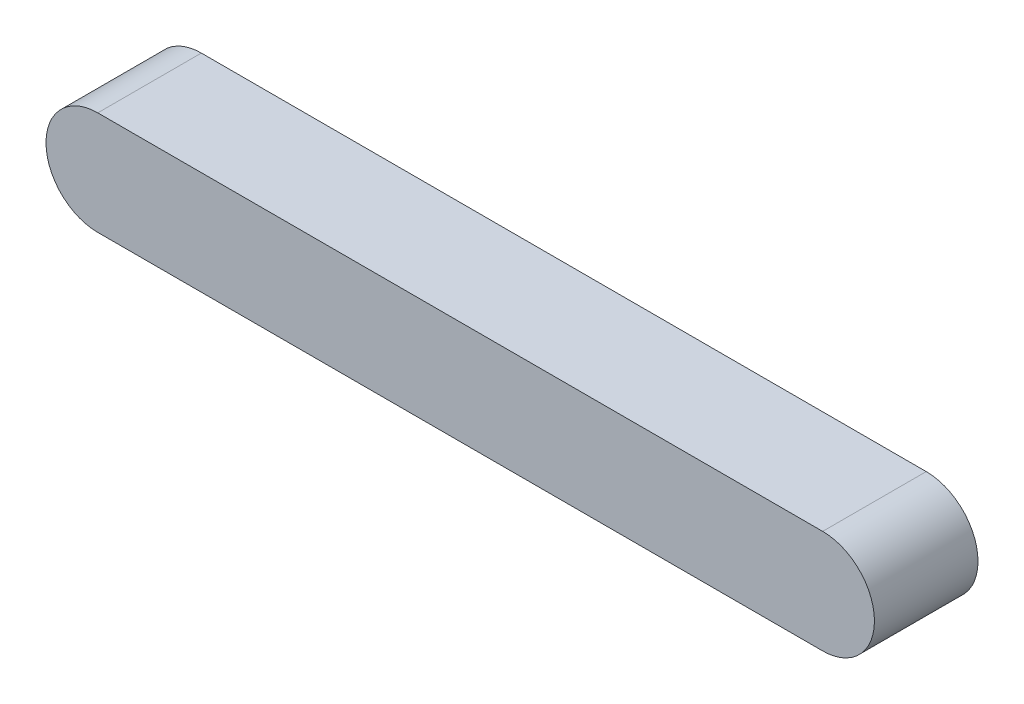
ISO-10303-21;
HEADER;
FILE_DESCRIPTION(('STEP AP214'),'2;1');
FILE_NAME('part.step','',(''),(''),'','','');
FILE_SCHEMA(('AUTOMOTIVE_DESIGN { 1 0 10303 214 1 1 1 1 }'));
ENDSEC;
DATA;
#1=APPLICATION_CONTEXT('core data for automotive mechanical design processes');
#2=APPLICATION_PROTOCOL_DEFINITION('international standard','automotive_design',2000,#1);
#3=PRODUCT_CONTEXT('',#1,'mechanical');
#4=PRODUCT('Part','Part','',(#3));
#5=PRODUCT_RELATED_PRODUCT_CATEGORY('part','',(#4));
#6=PRODUCT_DEFINITION_FORMATION('','',#4);
#7=PRODUCT_DEFINITION_CONTEXT('part definition',#1,'design');
#8=PRODUCT_DEFINITION('design','',#6,#7);
#9=PRODUCT_DEFINITION_SHAPE('','',#8);
#10=(LENGTH_UNIT() NAMED_UNIT(*) SI_UNIT(.MILLI.,.METRE.));
#11=(NAMED_UNIT(*) PLANE_ANGLE_UNIT() SI_UNIT($,.RADIAN.));
#12=(NAMED_UNIT(*) SI_UNIT($,.STERADIAN.) SOLID_ANGLE_UNIT());
#13=UNCERTAINTY_MEASURE_WITH_UNIT(LENGTH_MEASURE(1.E-05),#10,'distance_accuracy_value','');
#14=(GEOMETRIC_REPRESENTATION_CONTEXT(3) GLOBAL_UNCERTAINTY_ASSIGNED_CONTEXT((#13)) GLOBAL_UNIT_ASSIGNED_CONTEXT((#10,
#11,#12)) REPRESENTATION_CONTEXT('',''));
#15=CARTESIAN_POINT('',(0.,0.,0.));
#16=DIRECTION('',(0.,0.,1.));
#17=DIRECTION('',(1.,0.,0.));
#18=AXIS2_PLACEMENT_3D('',#15,#16,#17);
#19=CARTESIAN_POINT('',(-70.,0.,20.));
#20=DIRECTION('',(0.,0.,-1.));
#21=DIRECTION('',(-1.,0.,0.));
#22=AXIS2_PLACEMENT_3D('',#19,#20,#21);
#23=CYLINDRICAL_SURFACE('',#22,9.99999999999995);
#24=CARTESIAN_POINT('',(-70.,0.,0.));
#25=DIRECTION('',(0.,0.,1.));
#26=DIRECTION('',(1.,0.,0.));
#27=AXIS2_PLACEMENT_3D('',#24,#25,#26);
#28=CIRCLE('',#27,9.99999999999995);
#29=CARTESIAN_POINT('',(-70.,9.99999999999995,0.));
#30=VERTEX_POINT('',#29);
#31=CARTESIAN_POINT('',(-70.,-9.99999999999995,0.));
#32=VERTEX_POINT('',#31);
#33=EDGE_CURVE('E100',#30,#32,#28,.T.);
#34=ORIENTED_EDGE('',*,*,#33,.T.);
#35=DIRECTION('',(0.,0.,-1.));
#36=VECTOR('',#35,1.);
#37=CARTESIAN_POINT('',(-70.,-9.99999999999995,20.));
#38=LINE('',#37,#36);
#39=CARTESIAN_POINT('',(-70.,-9.99999999999995,20.));
#40=VERTEX_POINT('',#39);
#41=EDGE_CURVE('E11',#40,#32,#38,.T.);
#42=ORIENTED_EDGE('',*,*,#41,.F.);
#43=CARTESIAN_POINT('',(-70.,0.,20.));
#44=DIRECTION('',(0.,0.,1.));
#45=DIRECTION('',(1.,0.,0.));
#46=AXIS2_PLACEMENT_3D('',#43,#44,#45);
#47=CIRCLE('',#46,9.99999999999995);
#48=CARTESIAN_POINT('',(-70.,9.99999999999995,20.));
#49=VERTEX_POINT('',#48);
#50=EDGE_CURVE('E88',#49,#40,#47,.T.);
#51=ORIENTED_EDGE('',*,*,#50,.F.);
#52=DIRECTION('',(0.,0.,-1.));
#53=VECTOR('',#52,1.);
#54=CARTESIAN_POINT('',(-70.,9.99999999999995,20.));
#55=LINE('',#54,#53);
#56=EDGE_CURVE('E96',#49,#30,#55,.T.);
#57=ORIENTED_EDGE('',*,*,#56,.T.);
#58=EDGE_LOOP('',(#34,#42,#51,#57));
#59=FACE_BOUND('',#58,.T.);
#60=ADVANCED_FACE('F37',(#59),#23,.T.);
#61=CARTESIAN_POINT('',(-70.,-9.99999999999995,20.));
#62=DIRECTION('',(0.,1.,0.));
#63=DIRECTION('',(-1.,0.,0.));
#64=AXIS2_PLACEMENT_3D('',#61,#62,#63);
#65=PLANE('',#64);
#66=DIRECTION('',(1.,0.,0.));
#67=VECTOR('',#66,1.);
#68=CARTESIAN_POINT('',(-70.,-9.99999999999995,0.));
#69=LINE('',#68,#67);
#70=CARTESIAN_POINT('',(70.,-9.99999999999995,0.));
#71=VERTEX_POINT('',#70);
#72=EDGE_CURVE('E92',#32,#71,#69,.T.);
#73=ORIENTED_EDGE('',*,*,#72,.T.);
#74=DIRECTION('',(0.,0.,-1.));
#75=VECTOR('',#74,1.);
#76=CARTESIAN_POINT('',(70.,-9.99999999999995,20.));
#77=LINE('',#76,#75);
#78=CARTESIAN_POINT('',(70.,-9.99999999999995,20.));
#79=VERTEX_POINT('',#78);
#80=EDGE_CURVE('E45',#79,#71,#77,.T.);
#81=ORIENTED_EDGE('',*,*,#80,.F.);
#82=DIRECTION('',(1.,0.,0.));
#83=VECTOR('',#82,1.);
#84=CARTESIAN_POINT('',(-70.,-9.99999999999995,20.));
#85=LINE('',#84,#83);
#86=EDGE_CURVE('E83',#40,#79,#85,.T.);
#87=ORIENTED_EDGE('',*,*,#86,.F.);
#88=ORIENTED_EDGE('',*,*,#41,.T.);
#89=EDGE_LOOP('',(#73,#81,#87,#88));
#90=FACE_BOUND('',#89,.T.);
#91=ADVANCED_FACE('F91',(#90),#65,.F.);
#92=CARTESIAN_POINT('',(70.,0.,20.));
#93=DIRECTION('',(0.,0.,-1.));
#94=DIRECTION('',(-1.,0.,0.));
#95=AXIS2_PLACEMENT_3D('',#92,#93,#94);
#96=CYLINDRICAL_SURFACE('',#95,9.99999999999995);
#97=CARTESIAN_POINT('',(70.,0.,0.));
#98=DIRECTION('',(0.,0.,1.));
#99=DIRECTION('',(1.,0.,0.));
#100=AXIS2_PLACEMENT_3D('',#97,#98,#99);
#101=CIRCLE('',#100,9.99999999999995);
#102=CARTESIAN_POINT('',(70.,9.99999999999997,0.));
#103=VERTEX_POINT('',#102);
#104=EDGE_CURVE('E70',#71,#103,#101,.T.);
#105=ORIENTED_EDGE('',*,*,#104,.T.);
#106=DIRECTION('',(0.,0.,-1.));
#107=VECTOR('',#106,1.);
#108=CARTESIAN_POINT('',(70.,9.99999999999997,20.));
#109=LINE('',#108,#107);
#110=CARTESIAN_POINT('',(70.,9.99999999999997,20.));
#111=VERTEX_POINT('',#110);
#112=EDGE_CURVE('E93',#111,#103,#109,.T.);
#113=ORIENTED_EDGE('',*,*,#112,.F.);
#114=CARTESIAN_POINT('',(70.,0.,20.));
#115=DIRECTION('',(0.,0.,1.));
#116=DIRECTION('',(1.,0.,0.));
#117=AXIS2_PLACEMENT_3D('',#114,#115,#116);
#118=CIRCLE('',#117,9.99999999999995);
#119=EDGE_CURVE('E86',#79,#111,#118,.T.);
#120=ORIENTED_EDGE('',*,*,#119,.F.);
#121=ORIENTED_EDGE('',*,*,#80,.T.);
#122=EDGE_LOOP('',(#105,#113,#120,#121));
#123=FACE_BOUND('',#122,.T.);
#124=ADVANCED_FACE('F94',(#123),#96,.T.);
#125=CARTESIAN_POINT('',(-70.,9.99999999999995,20.));
#126=DIRECTION('',(0.,-1.,0.));
#127=DIRECTION('',(1.,0.,0.));
#128=AXIS2_PLACEMENT_3D('',#125,#126,#127);
#129=PLANE('',#128);
#130=DIRECTION('',(-1.,0.,0.));
#131=VECTOR('',#130,1.);
#132=CARTESIAN_POINT('',(-70.,9.99999999999995,0.));
#133=LINE('',#132,#131);
#134=EDGE_CURVE('E76',#103,#30,#133,.T.);
#135=ORIENTED_EDGE('',*,*,#134,.T.);
#136=ORIENTED_EDGE('',*,*,#56,.F.);
#137=DIRECTION('',(-1.,0.,0.));
#138=VECTOR('',#137,1.);
#139=CARTESIAN_POINT('',(-70.,9.99999999999995,20.));
#140=LINE('',#139,#138);
#141=EDGE_CURVE('E53',#111,#49,#140,.T.);
#142=ORIENTED_EDGE('',*,*,#141,.F.);
#143=ORIENTED_EDGE('',*,*,#112,.T.);
#144=EDGE_LOOP('',(#135,#136,#142,#143));
#145=FACE_BOUND('',#144,.T.);
#146=ADVANCED_FACE('F107',(#145),#129,.F.);
#147=CARTESIAN_POINT('',(-70.,0.,20.));
#148=DIRECTION('',(0.,0.,1.));
#149=DIRECTION('',(1.,0.,0.));
#150=AXIS2_PLACEMENT_3D('',#147,#148,#149);
#151=PLANE('',#150);
#152=ORIENTED_EDGE('',*,*,#50,.T.);
#153=ORIENTED_EDGE('',*,*,#86,.T.);
#154=ORIENTED_EDGE('',*,*,#119,.T.);
#155=ORIENTED_EDGE('',*,*,#141,.T.);
#156=EDGE_LOOP('',(#152,#153,#154,#155));
#157=FACE_BOUND('',#156,.T.);
#158=ADVANCED_FACE('F84',(#157),#151,.T.);
#159=CARTESIAN_POINT('',(-70.,0.,0.));
#160=DIRECTION('',(0.,0.,1.));
#161=DIRECTION('',(1.,0.,0.));
#162=AXIS2_PLACEMENT_3D('',#159,#160,#161);
#163=PLANE('',#162);
#164=ORIENTED_EDGE('',*,*,#33,.F.);
#165=ORIENTED_EDGE('',*,*,#134,.F.);
#166=ORIENTED_EDGE('',*,*,#104,.F.);
#167=ORIENTED_EDGE('',*,*,#72,.F.);
#168=EDGE_LOOP('',(#164,#165,#166,#167));
#169=FACE_BOUND('',#168,.T.);
#170=ADVANCED_FACE('F110',(#169),#163,.F.);
#171=CLOSED_SHELL('',(#60,#91,#124,#146,#158,#170));
#172=MANIFOLD_SOLID_BREP('B2',#171);
#173=ADVANCED_BREP_SHAPE_REPRESENTATION('',(#18,#172),#14);
#174=SHAPE_DEFINITION_REPRESENTATION(#9,#173);
ENDSEC;
END-ISO-10303-21;
